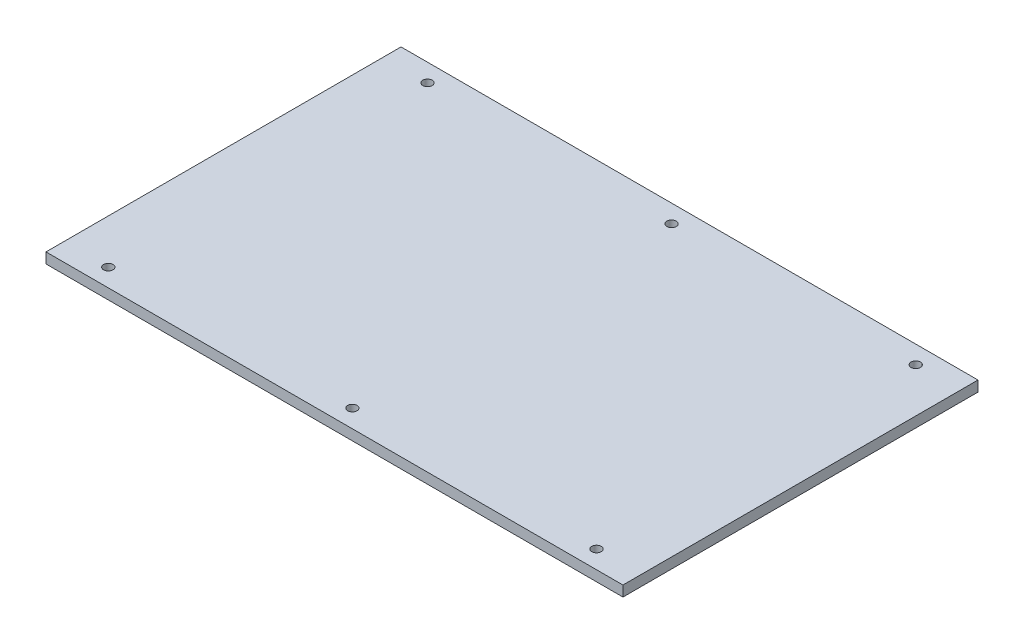
ISO-10303-21;
HEADER;
FILE_DESCRIPTION(('STEP AP214'),'2;1');
FILE_NAME('part.step','',(''),(''),'','','');
FILE_SCHEMA(('AUTOMOTIVE_DESIGN { 1 0 10303 214 1 1 1 1 }'));
ENDSEC;
DATA;
#1=APPLICATION_CONTEXT('core data for automotive mechanical design processes');
#2=APPLICATION_PROTOCOL_DEFINITION('international standard','automotive_design',2000,#1);
#3=PRODUCT_CONTEXT('',#1,'mechanical');
#4=PRODUCT('Part','Part','',(#3));
#5=PRODUCT_RELATED_PRODUCT_CATEGORY('part','',(#4));
#6=PRODUCT_DEFINITION_FORMATION('','',#4);
#7=PRODUCT_DEFINITION_CONTEXT('part definition',#1,'design');
#8=PRODUCT_DEFINITION('design','',#6,#7);
#9=PRODUCT_DEFINITION_SHAPE('','',#8);
#10=(LENGTH_UNIT() NAMED_UNIT(*) SI_UNIT(.MILLI.,.METRE.));
#11=(NAMED_UNIT(*) PLANE_ANGLE_UNIT() SI_UNIT($,.RADIAN.));
#12=(NAMED_UNIT(*) SI_UNIT($,.STERADIAN.) SOLID_ANGLE_UNIT());
#13=UNCERTAINTY_MEASURE_WITH_UNIT(LENGTH_MEASURE(1.E-05),#10,'distance_accuracy_value','');
#14=(GEOMETRIC_REPRESENTATION_CONTEXT(3) GLOBAL_UNCERTAINTY_ASSIGNED_CONTEXT((#13)) GLOBAL_UNIT_ASSIGNED_CONTEXT((#10,
#11,#12)) REPRESENTATION_CONTEXT('',''));
#15=CARTESIAN_POINT('',(0.,0.,0.));
#16=DIRECTION('',(0.,0.,1.));
#17=DIRECTION('',(1.,0.,0.));
#18=AXIS2_PLACEMENT_3D('',#15,#16,#17);
#19=CARTESIAN_POINT('',(0.,3.,101.6));
#20=DIRECTION('',(0.,-1.,0.));
#21=DIRECTION('',(0.,0.,-1.));
#22=AXIS2_PLACEMENT_3D('',#19,#20,#21);
#23=PLANE('',#22);
#24=CARTESIAN_POINT('',(82.55,3.,5.13079999999999));
#25=DIRECTION('',(0.,1.,0.));
#26=DIRECTION('',(0.,0.,1.));
#27=AXIS2_PLACEMENT_3D('',#24,#25,#26);
#28=CIRCLE('',#27,1.3462);
#29=CARTESIAN_POINT('',(82.55,3.,6.47699999999999));
#30=VERTEX_POINT('',#29);
#31=EDGE_CURVE('E131',#30,#30,#28,.T.);
#32=ORIENTED_EDGE('',*,*,#31,.F.);
#33=EDGE_LOOP('',(#32));
#34=FACE_BOUND('',#33,.T.);
#35=CARTESIAN_POINT('',(12.7,3.,5.13079999999999));
#36=DIRECTION('',(0.,1.,0.));
#37=DIRECTION('',(0.,0.,1.));
#38=AXIS2_PLACEMENT_3D('',#35,#36,#37);
#39=CIRCLE('',#38,1.3462);
#40=CARTESIAN_POINT('',(12.7,3.,6.47699999999999));
#41=VERTEX_POINT('',#40);
#42=EDGE_CURVE('E137',#41,#41,#39,.T.);
#43=ORIENTED_EDGE('',*,*,#42,.F.);
#44=EDGE_LOOP('',(#43));
#45=FACE_BOUND('',#44,.T.);
#46=CARTESIAN_POINT('',(12.7,3.,96.4692));
#47=DIRECTION('',(0.,1.,0.));
#48=DIRECTION('',(0.,0.,1.));
#49=AXIS2_PLACEMENT_3D('',#46,#47,#48);
#50=CIRCLE('',#49,1.3462);
#51=CARTESIAN_POINT('',(12.7,3.,97.8154));
#52=VERTEX_POINT('',#51);
#53=EDGE_CURVE('E143',#52,#52,#50,.T.);
#54=ORIENTED_EDGE('',*,*,#53,.F.);
#55=EDGE_LOOP('',(#54));
#56=FACE_BOUND('',#55,.T.);
#57=CARTESIAN_POINT('',(82.55,3.,96.4692));
#58=DIRECTION('',(0.,1.,0.));
#59=DIRECTION('',(0.,0.,1.));
#60=AXIS2_PLACEMENT_3D('',#57,#58,#59);
#61=CIRCLE('',#60,1.3462);
#62=CARTESIAN_POINT('',(82.55,3.,97.8154));
#63=VERTEX_POINT('',#62);
#64=EDGE_CURVE('E119',#63,#63,#61,.T.);
#65=ORIENTED_EDGE('',*,*,#64,.F.);
#66=EDGE_LOOP('',(#65));
#67=FACE_BOUND('',#66,.T.);
#68=CARTESIAN_POINT('',(152.4,3.,96.4692));
#69=DIRECTION('',(0.,1.,0.));
#70=DIRECTION('',(0.,0.,1.));
#71=AXIS2_PLACEMENT_3D('',#68,#69,#70);
#72=CIRCLE('',#71,1.34619999999999);
#73=CARTESIAN_POINT('',(152.4,3.,97.8154));
#74=VERTEX_POINT('',#73);
#75=EDGE_CURVE('E126',#74,#74,#72,.T.);
#76=ORIENTED_EDGE('',*,*,#75,.F.);
#77=EDGE_LOOP('',(#76));
#78=FACE_BOUND('',#77,.T.);
#79=CARTESIAN_POINT('',(152.4,3.,5.13079999999999));
#80=DIRECTION('',(0.,1.,0.));
#81=DIRECTION('',(0.,0.,1.));
#82=AXIS2_PLACEMENT_3D('',#79,#80,#81);
#83=CIRCLE('',#82,1.34619999999999);
#84=CARTESIAN_POINT('',(152.4,3.,6.47699999999998));
#85=VERTEX_POINT('',#84);
#86=EDGE_CURVE('E113',#85,#85,#83,.T.);
#87=ORIENTED_EDGE('',*,*,#86,.F.);
#88=EDGE_LOOP('',(#87));
#89=FACE_BOUND('',#88,.T.);
#90=DIRECTION('',(1.,0.,0.));
#91=VECTOR('',#90,1.);
#92=CARTESIAN_POINT('',(0.,3.,0.));
#93=LINE('',#92,#91);
#94=CARTESIAN_POINT('',(165.1,3.,0.));
#95=VERTEX_POINT('',#94);
#96=CARTESIAN_POINT('',(0.,3.,0.));
#97=VERTEX_POINT('',#96);
#98=EDGE_CURVE('E101',#95,#97,#93,.F.);
#99=ORIENTED_EDGE('',*,*,#98,.T.);
#100=DIRECTION('',(0.,0.,-1.));
#101=VECTOR('',#100,1.);
#102=CARTESIAN_POINT('',(0.,3.,101.6));
#103=LINE('',#102,#101);
#104=CARTESIAN_POINT('',(0.,3.,101.6));
#105=VERTEX_POINT('',#104);
#106=EDGE_CURVE('E11',#105,#97,#103,.T.);
#107=ORIENTED_EDGE('',*,*,#106,.F.);
#108=DIRECTION('',(1.,0.,0.));
#109=VECTOR('',#108,1.);
#110=CARTESIAN_POINT('',(0.,3.,101.6));
#111=LINE('',#110,#109);
#112=CARTESIAN_POINT('',(165.1,3.,101.6));
#113=VERTEX_POINT('',#112);
#114=EDGE_CURVE('E78',#113,#105,#111,.F.);
#115=ORIENTED_EDGE('',*,*,#114,.F.);
#116=DIRECTION('',(0.,0.,-1.));
#117=VECTOR('',#116,1.);
#118=CARTESIAN_POINT('',(165.1,3.,101.6));
#119=LINE('',#118,#117);
#120=EDGE_CURVE('E54',#113,#95,#119,.T.);
#121=ORIENTED_EDGE('',*,*,#120,.T.);
#122=EDGE_LOOP('',(#99,#107,#115,#121));
#123=FACE_BOUND('',#122,.T.);
#124=ADVANCED_FACE('F38',(#34,#45,#56,#67,#78,#89,#123),#23,.F.);
#125=CARTESIAN_POINT('',(0.,0.,101.6));
#126=DIRECTION('',(-1.,0.,0.));
#127=DIRECTION('',(0.,0.,1.));
#128=AXIS2_PLACEMENT_3D('',#125,#126,#127);
#129=PLANE('',#128);
#130=DIRECTION('',(0.,1.,0.));
#131=VECTOR('',#130,1.);
#132=CARTESIAN_POINT('',(0.,0.,0.));
#133=LINE('',#132,#131);
#134=CARTESIAN_POINT('',(0.,0.,0.));
#135=VERTEX_POINT('',#134);
#136=EDGE_CURVE('E87',#135,#97,#133,.T.);
#137=ORIENTED_EDGE('',*,*,#136,.F.);
#138=DIRECTION('',(0.,0.,-1.));
#139=VECTOR('',#138,1.);
#140=CARTESIAN_POINT('',(0.,0.,101.6));
#141=LINE('',#140,#139);
#142=CARTESIAN_POINT('',(0.,0.,101.6));
#143=VERTEX_POINT('',#142);
#144=EDGE_CURVE('E46',#143,#135,#141,.T.);
#145=ORIENTED_EDGE('',*,*,#144,.F.);
#146=DIRECTION('',(0.,1.,0.));
#147=VECTOR('',#146,1.);
#148=CARTESIAN_POINT('',(0.,0.,101.6));
#149=LINE('',#148,#147);
#150=EDGE_CURVE('E85',#143,#105,#149,.T.);
#151=ORIENTED_EDGE('',*,*,#150,.T.);
#152=ORIENTED_EDGE('',*,*,#106,.T.);
#153=EDGE_LOOP('',(#137,#145,#151,#152));
#154=FACE_BOUND('',#153,.T.);
#155=ADVANCED_FACE('F84',(#154),#129,.T.);
#156=CARTESIAN_POINT('',(0.,0.,101.6));
#157=DIRECTION('',(0.,-1.,0.));
#158=DIRECTION('',(0.,0.,-1.));
#159=AXIS2_PLACEMENT_3D('',#156,#157,#158);
#160=PLANE('',#159);
#161=CARTESIAN_POINT('',(82.55,0.,5.13079999999999));
#162=DIRECTION('',(0.,1.,0.));
#163=DIRECTION('',(0.,0.,1.));
#164=AXIS2_PLACEMENT_3D('',#161,#162,#163);
#165=CIRCLE('',#164,1.3462);
#166=CARTESIAN_POINT('',(82.55,0.,6.47699999999999));
#167=VERTEX_POINT('',#166);
#168=EDGE_CURVE('E134',#167,#167,#165,.T.);
#169=ORIENTED_EDGE('',*,*,#168,.T.);
#170=EDGE_LOOP('',(#169));
#171=FACE_BOUND('',#170,.T.);
#172=CARTESIAN_POINT('',(12.7,0.,5.13079999999999));
#173=DIRECTION('',(0.,1.,0.));
#174=DIRECTION('',(0.,0.,1.));
#175=AXIS2_PLACEMENT_3D('',#172,#173,#174);
#176=CIRCLE('',#175,1.3462);
#177=CARTESIAN_POINT('',(12.7,0.,6.47699999999999));
#178=VERTEX_POINT('',#177);
#179=EDGE_CURVE('E140',#178,#178,#176,.T.);
#180=ORIENTED_EDGE('',*,*,#179,.T.);
#181=EDGE_LOOP('',(#180));
#182=FACE_BOUND('',#181,.T.);
#183=CARTESIAN_POINT('',(12.7,0.,96.4692));
#184=DIRECTION('',(0.,1.,0.));
#185=DIRECTION('',(0.,0.,1.));
#186=AXIS2_PLACEMENT_3D('',#183,#184,#185);
#187=CIRCLE('',#186,1.3462);
#188=CARTESIAN_POINT('',(12.7,0.,97.8154));
#189=VERTEX_POINT('',#188);
#190=EDGE_CURVE('E123',#189,#189,#187,.T.);
#191=ORIENTED_EDGE('',*,*,#190,.T.);
#192=EDGE_LOOP('',(#191));
#193=FACE_BOUND('',#192,.T.);
#194=CARTESIAN_POINT('',(82.55,0.,96.4692));
#195=DIRECTION('',(0.,1.,0.));
#196=DIRECTION('',(0.,0.,1.));
#197=AXIS2_PLACEMENT_3D('',#194,#195,#196);
#198=CIRCLE('',#197,1.3462);
#199=CARTESIAN_POINT('',(82.55,0.,97.8154));
#200=VERTEX_POINT('',#199);
#201=EDGE_CURVE('E122',#200,#200,#198,.T.);
#202=ORIENTED_EDGE('',*,*,#201,.T.);
#203=EDGE_LOOP('',(#202));
#204=FACE_BOUND('',#203,.T.);
#205=CARTESIAN_POINT('',(152.4,0.,96.4692));
#206=DIRECTION('',(0.,1.,0.));
#207=DIRECTION('',(0.,0.,1.));
#208=AXIS2_PLACEMENT_3D('',#205,#206,#207);
#209=CIRCLE('',#208,1.34619999999999);
#210=CARTESIAN_POINT('',(152.4,0.,97.8154));
#211=VERTEX_POINT('',#210);
#212=EDGE_CURVE('E116',#211,#211,#209,.T.);
#213=ORIENTED_EDGE('',*,*,#212,.T.);
#214=EDGE_LOOP('',(#213));
#215=FACE_BOUND('',#214,.T.);
#216=CARTESIAN_POINT('',(152.4,0.,5.13079999999999));
#217=DIRECTION('',(0.,1.,0.));
#218=DIRECTION('',(0.,0.,1.));
#219=AXIS2_PLACEMENT_3D('',#216,#217,#218);
#220=CIRCLE('',#219,1.34619999999999);
#221=CARTESIAN_POINT('',(152.4,0.,6.47699999999998));
#222=VERTEX_POINT('',#221);
#223=EDGE_CURVE('E103',#222,#222,#220,.T.);
#224=ORIENTED_EDGE('',*,*,#223,.T.);
#225=EDGE_LOOP('',(#224));
#226=FACE_BOUND('',#225,.T.);
#227=DIRECTION('',(-1.,0.,0.));
#228=VECTOR('',#227,1.);
#229=CARTESIAN_POINT('',(0.,0.,0.));
#230=LINE('',#229,#228);
#231=CARTESIAN_POINT('',(165.1,0.,0.));
#232=VERTEX_POINT('',#231);
#233=EDGE_CURVE('E105',#232,#135,#230,.T.);
#234=ORIENTED_EDGE('',*,*,#233,.F.);
#235=DIRECTION('',(0.,0.,-1.));
#236=VECTOR('',#235,1.);
#237=CARTESIAN_POINT('',(165.1,0.,101.6));
#238=LINE('',#237,#236);
#239=CARTESIAN_POINT('',(165.1,0.,101.6));
#240=VERTEX_POINT('',#239);
#241=EDGE_CURVE('E67',#240,#232,#238,.T.);
#242=ORIENTED_EDGE('',*,*,#241,.F.);
#243=DIRECTION('',(-1.,0.,0.));
#244=VECTOR('',#243,1.);
#245=CARTESIAN_POINT('',(0.,0.,101.6));
#246=LINE('',#245,#244);
#247=EDGE_CURVE('E93',#240,#143,#246,.T.);
#248=ORIENTED_EDGE('',*,*,#247,.T.);
#249=ORIENTED_EDGE('',*,*,#144,.T.);
#250=EDGE_LOOP('',(#234,#242,#248,#249));
#251=FACE_BOUND('',#250,.T.);
#252=ADVANCED_FACE('F95',(#171,#182,#193,#204,#215,#226,#251),#160,.T.);
#253=CARTESIAN_POINT('',(165.1,3.,101.6));
#254=DIRECTION('',(1.,0.,0.));
#255=DIRECTION('',(0.,0.,-1.));
#256=AXIS2_PLACEMENT_3D('',#253,#254,#255);
#257=PLANE('',#256);
#258=DIRECTION('',(0.,-1.,0.));
#259=VECTOR('',#258,1.);
#260=CARTESIAN_POINT('',(165.1,3.,0.));
#261=LINE('',#260,#259);
#262=EDGE_CURVE('E107',#95,#232,#261,.T.);
#263=ORIENTED_EDGE('',*,*,#262,.F.);
#264=ORIENTED_EDGE('',*,*,#120,.F.);
#265=DIRECTION('',(0.,-1.,0.));
#266=VECTOR('',#265,1.);
#267=CARTESIAN_POINT('',(165.1,3.,101.6));
#268=LINE('',#267,#266);
#269=EDGE_CURVE('E96',#113,#240,#268,.T.);
#270=ORIENTED_EDGE('',*,*,#269,.T.);
#271=ORIENTED_EDGE('',*,*,#241,.T.);
#272=EDGE_LOOP('',(#263,#264,#270,#271));
#273=FACE_BOUND('',#272,.T.);
#274=ADVANCED_FACE('F178',(#273),#257,.T.);
#275=CARTESIAN_POINT('',(0.,0.,101.6));
#276=DIRECTION('',(0.,0.,1.));
#277=DIRECTION('',(1.,0.,0.));
#278=AXIS2_PLACEMENT_3D('',#275,#276,#277);
#279=PLANE('',#278);
#280=ORIENTED_EDGE('',*,*,#114,.T.);
#281=ORIENTED_EDGE('',*,*,#150,.F.);
#282=ORIENTED_EDGE('',*,*,#247,.F.);
#283=ORIENTED_EDGE('',*,*,#269,.F.);
#284=EDGE_LOOP('',(#280,#281,#282,#283));
#285=FACE_BOUND('',#284,.T.);
#286=ADVANCED_FACE('F92',(#285),#279,.T.);
#287=CARTESIAN_POINT('',(0.,0.,0.));
#288=DIRECTION('',(0.,0.,1.));
#289=DIRECTION('',(1.,0.,0.));
#290=AXIS2_PLACEMENT_3D('',#287,#288,#289);
#291=PLANE('',#290);
#292=ORIENTED_EDGE('',*,*,#98,.F.);
#293=ORIENTED_EDGE('',*,*,#262,.T.);
#294=ORIENTED_EDGE('',*,*,#233,.T.);
#295=ORIENTED_EDGE('',*,*,#136,.T.);
#296=EDGE_LOOP('',(#292,#293,#294,#295));
#297=FACE_BOUND('',#296,.T.);
#298=ADVANCED_FACE('F167',(#297),#291,.F.);
#299=CARTESIAN_POINT('',(152.4,0.,5.13079999999999));
#300=DIRECTION('',(0.,1.,0.));
#301=DIRECTION('',(0.,0.,1.));
#302=AXIS2_PLACEMENT_3D('',#299,#300,#301);
#303=CYLINDRICAL_SURFACE('',#302,1.34619999999999);
#304=ORIENTED_EDGE('',*,*,#223,.F.);
#305=EDGE_LOOP('',(#304));
#306=FACE_BOUND('',#305,.T.);
#307=ORIENTED_EDGE('',*,*,#86,.T.);
#308=EDGE_LOOP('',(#307));
#309=FACE_BOUND('',#308,.T.);
#310=ADVANCED_FACE('F169',(#306,#309),#303,.F.);
#311=CARTESIAN_POINT('',(152.4,0.,96.4692));
#312=DIRECTION('',(0.,1.,0.));
#313=DIRECTION('',(0.,0.,1.));
#314=AXIS2_PLACEMENT_3D('',#311,#312,#313);
#315=CYLINDRICAL_SURFACE('',#314,1.34619999999999);
#316=ORIENTED_EDGE('',*,*,#212,.F.);
#317=EDGE_LOOP('',(#316));
#318=FACE_BOUND('',#317,.T.);
#319=ORIENTED_EDGE('',*,*,#75,.T.);
#320=EDGE_LOOP('',(#319));
#321=FACE_BOUND('',#320,.T.);
#322=ADVANCED_FACE('F175',(#318,#321),#315,.F.);
#323=CARTESIAN_POINT('',(82.55,0.,96.4692));
#324=DIRECTION('',(0.,1.,0.));
#325=DIRECTION('',(0.,0.,1.));
#326=AXIS2_PLACEMENT_3D('',#323,#324,#325);
#327=CYLINDRICAL_SURFACE('',#326,1.3462);
#328=ORIENTED_EDGE('',*,*,#201,.F.);
#329=EDGE_LOOP('',(#328));
#330=FACE_BOUND('',#329,.T.);
#331=ORIENTED_EDGE('',*,*,#64,.T.);
#332=EDGE_LOOP('',(#331));
#333=FACE_BOUND('',#332,.T.);
#334=ADVANCED_FACE('F155',(#330,#333),#327,.F.);
#335=CARTESIAN_POINT('',(12.7,0.,96.4692));
#336=DIRECTION('',(0.,1.,0.));
#337=DIRECTION('',(0.,0.,1.));
#338=AXIS2_PLACEMENT_3D('',#335,#336,#337);
#339=CYLINDRICAL_SURFACE('',#338,1.3462);
#340=ORIENTED_EDGE('',*,*,#190,.F.);
#341=EDGE_LOOP('',(#340));
#342=FACE_BOUND('',#341,.T.);
#343=ORIENTED_EDGE('',*,*,#53,.T.);
#344=EDGE_LOOP('',(#343));
#345=FACE_BOUND('',#344,.T.);
#346=ADVANCED_FACE('F151',(#342,#345),#339,.F.);
#347=CARTESIAN_POINT('',(12.7,0.,5.13079999999999));
#348=DIRECTION('',(0.,1.,0.));
#349=DIRECTION('',(0.,0.,1.));
#350=AXIS2_PLACEMENT_3D('',#347,#348,#349);
#351=CYLINDRICAL_SURFACE('',#350,1.3462);
#352=ORIENTED_EDGE('',*,*,#179,.F.);
#353=EDGE_LOOP('',(#352));
#354=FACE_BOUND('',#353,.T.);
#355=ORIENTED_EDGE('',*,*,#42,.T.);
#356=EDGE_LOOP('',(#355));
#357=FACE_BOUND('',#356,.T.);
#358=ADVANCED_FACE('F154',(#354,#357),#351,.F.);
#359=CARTESIAN_POINT('',(82.55,0.,5.13079999999999));
#360=DIRECTION('',(0.,1.,0.));
#361=DIRECTION('',(0.,0.,1.));
#362=AXIS2_PLACEMENT_3D('',#359,#360,#361);
#363=CYLINDRICAL_SURFACE('',#362,1.3462);
#364=ORIENTED_EDGE('',*,*,#168,.F.);
#365=EDGE_LOOP('',(#364));
#366=FACE_BOUND('',#365,.T.);
#367=ORIENTED_EDGE('',*,*,#31,.T.);
#368=EDGE_LOOP('',(#367));
#369=FACE_BOUND('',#368,.T.);
#370=ADVANCED_FACE('F259',(#366,#369),#363,.F.);
#371=CLOSED_SHELL('',(#124,#155,#252,#274,#286,#298,#310,#322,#334,#346,#358,#370));
#372=MANIFOLD_SOLID_BREP('B2',#371);
#373=ADVANCED_BREP_SHAPE_REPRESENTATION('',(#18,#372),#14);
#374=SHAPE_DEFINITION_REPRESENTATION(#9,#373);
ENDSEC;
END-ISO-10303-21;
